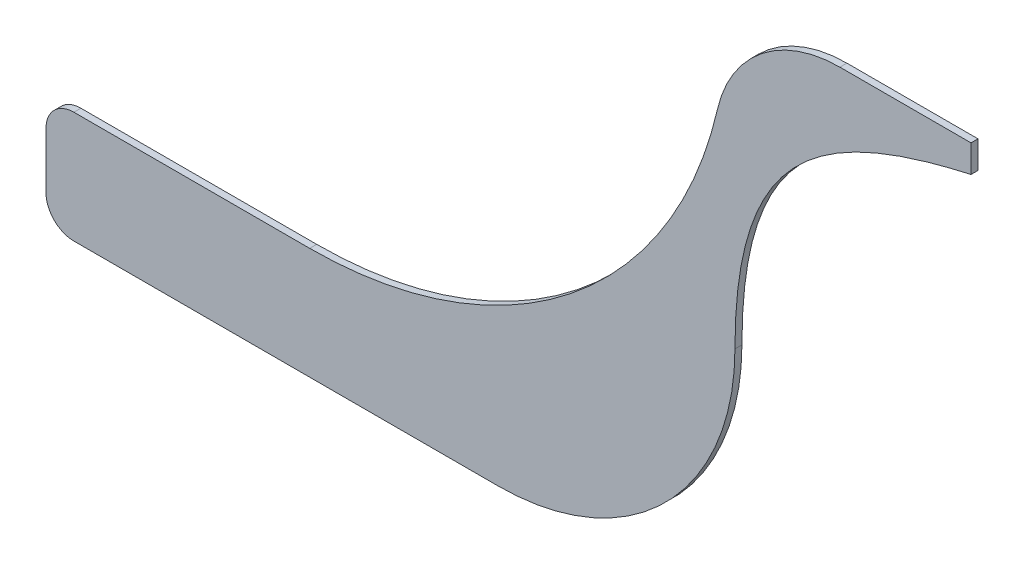
ISO-10303-21;
HEADER;
FILE_DESCRIPTION(('STEP AP214'),'2;1');
FILE_NAME('part.step','',(''),(''),'','','');
FILE_SCHEMA(('AUTOMOTIVE_DESIGN { 1 0 10303 214 1 1 1 1 }'));
ENDSEC;
DATA;
#1=APPLICATION_CONTEXT('core data for automotive mechanical design processes');
#2=APPLICATION_PROTOCOL_DEFINITION('international standard','automotive_design',2000,#1);
#3=PRODUCT_CONTEXT('',#1,'mechanical');
#4=PRODUCT('Part','Part','',(#3));
#5=PRODUCT_RELATED_PRODUCT_CATEGORY('part','',(#4));
#6=PRODUCT_DEFINITION_FORMATION('','',#4);
#7=PRODUCT_DEFINITION_CONTEXT('part definition',#1,'design');
#8=PRODUCT_DEFINITION('design','',#6,#7);
#9=PRODUCT_DEFINITION_SHAPE('','',#8);
#10=(LENGTH_UNIT() NAMED_UNIT(*) SI_UNIT(.MILLI.,.METRE.));
#11=(NAMED_UNIT(*) PLANE_ANGLE_UNIT() SI_UNIT($,.RADIAN.));
#12=(NAMED_UNIT(*) SI_UNIT($,.STERADIAN.) SOLID_ANGLE_UNIT());
#13=UNCERTAINTY_MEASURE_WITH_UNIT(LENGTH_MEASURE(1.E-05),#10,'distance_accuracy_value','');
#14=(GEOMETRIC_REPRESENTATION_CONTEXT(3) GLOBAL_UNCERTAINTY_ASSIGNED_CONTEXT((#13)) GLOBAL_UNIT_ASSIGNED_CONTEXT((#10,
#11,#12)) REPRESENTATION_CONTEXT('',''));
#15=CARTESIAN_POINT('',(0.,0.,0.));
#16=DIRECTION('',(0.,0.,1.));
#17=DIRECTION('',(1.,0.,0.));
#18=AXIS2_PLACEMENT_3D('',#15,#16,#17);
#19=CARTESIAN_POINT('',(390.725573839181,154.94,6.35));
#20=DIRECTION('',(0.,0.,-1.));
#21=DIRECTION('',(-1.,0.,0.));
#22=AXIS2_PLACEMENT_3D('',#19,#20,#21);
#23=CYLINDRICAL_SURFACE('',#22,215.9);
#24=CARTESIAN_POINT('',(390.725573839181,154.94,0.));
#25=DIRECTION('',(0.,0.,1.));
#26=DIRECTION('',(1.,0.,0.));
#27=AXIS2_PLACEMENT_3D('',#24,#25,#26);
#28=CIRCLE('',#27,215.9);
#29=CARTESIAN_POINT('',(390.725573839181,-60.96,0.));
#30=VERTEX_POINT('',#29);
#31=CARTESIAN_POINT('',(606.625573839181,154.94,0.));
#32=VERTEX_POINT('',#31);
#33=EDGE_CURVE('E147',#30,#32,#28,.T.);
#34=ORIENTED_EDGE('',*,*,#33,.T.);
#35=DIRECTION('',(0.,0.,-1.));
#36=VECTOR('',#35,1.);
#37=CARTESIAN_POINT('',(606.625573839181,154.94,6.35));
#38=LINE('',#37,#36);
#39=CARTESIAN_POINT('',(606.625573839181,154.94,6.35));
#40=VERTEX_POINT('',#39);
#41=EDGE_CURVE('E11',#40,#32,#38,.T.);
#42=ORIENTED_EDGE('',*,*,#41,.F.);
#43=CARTESIAN_POINT('',(390.725573839181,154.94,6.35));
#44=DIRECTION('',(0.,0.,1.));
#45=DIRECTION('',(1.,0.,0.));
#46=AXIS2_PLACEMENT_3D('',#43,#44,#45);
#47=CIRCLE('',#46,215.9);
#48=CARTESIAN_POINT('',(390.725573839181,-60.96,6.35));
#49=VERTEX_POINT('',#48);
#50=EDGE_CURVE('E176',#49,#40,#47,.T.);
#51=ORIENTED_EDGE('',*,*,#50,.F.);
#52=DIRECTION('',(0.,0.,-1.));
#53=VECTOR('',#52,1.);
#54=CARTESIAN_POINT('',(390.725573839181,-60.96,6.35));
#55=LINE('',#54,#53);
#56=EDGE_CURVE('E143',#49,#30,#55,.T.);
#57=ORIENTED_EDGE('',*,*,#56,.T.);
#58=EDGE_LOOP('',(#34,#42,#51,#57));
#59=FACE_BOUND('',#58,.T.);
#60=ADVANCED_FACE('F34',(#59),#23,.T.);
#61=CARTESIAN_POINT('',(606.625573839181,154.94,6.35));
#62=CARTESIAN_POINT('',(606.625573839181,316.010014209562,6.35));
#63=CARTESIAN_POINT('',(681.985382086751,368.523685091202,6.35));
#64=CARTESIAN_POINT('',(821.560436262669,399.924928327154,6.35));
#65=B_SPLINE_CURVE_WITH_KNOTS('',3,(#61,#62,#63,#64),.UNSPECIFIED.,.F.,.F.,(4,4),(0.,1.),.UNSPECIFIED.);
#66=DIRECTION('',(0.,0.,-1.));
#67=VECTOR('',#66,1.);
#68=SURFACE_OF_LINEAR_EXTRUSION('',#65,#67);
#69=CARTESIAN_POINT('',(606.625573839181,154.94,0.));
#70=CARTESIAN_POINT('',(606.625573839181,316.010014209562,0.));
#71=CARTESIAN_POINT('',(681.985382086751,368.523685091202,0.));
#72=CARTESIAN_POINT('',(821.560436262669,399.924928327154,0.));
#73=B_SPLINE_CURVE_WITH_KNOTS('',3,(#69,#70,#71,#72),.UNSPECIFIED.,.F.,.F.,(4,4),(0.,1.),.UNSPECIFIED.);
#74=CARTESIAN_POINT('',(821.560436262669,399.924928327154,0.));
#75=VERTEX_POINT('',#74);
#76=EDGE_CURVE('E150',#32,#75,#73,.T.);
#77=ORIENTED_EDGE('',*,*,#76,.T.);
#78=DIRECTION('',(0.,0.,-1.));
#79=VECTOR('',#78,1.);
#80=CARTESIAN_POINT('',(821.560436262669,399.924928327154,6.35));
#81=LINE('',#80,#79);
#82=CARTESIAN_POINT('',(821.560436262669,399.924928327154,6.35));
#83=VERTEX_POINT('',#82);
#84=EDGE_CURVE('E42',#83,#75,#81,.T.);
#85=ORIENTED_EDGE('',*,*,#84,.F.);
#86=EDGE_CURVE('E102',#40,#83,#65,.T.);
#87=ORIENTED_EDGE('',*,*,#86,.F.);
#88=ORIENTED_EDGE('',*,*,#41,.T.);
#89=EDGE_LOOP('',(#77,#85,#87,#88));
#90=FACE_BOUND('',#89,.T.);
#91=ADVANCED_FACE('F241',(#90),#68,.F.);
#92=CARTESIAN_POINT('',(821.560436262665,-7.31496953278176E-12,6.35));
#93=DIRECTION('',(-1.,0.,0.));
#94=DIRECTION('',(0.,-1.,0.));
#95=AXIS2_PLACEMENT_3D('',#92,#93,#94);
#96=PLANE('',#95);
#97=DIRECTION('',(0.,1.,0.));
#98=VECTOR('',#97,1.);
#99=CARTESIAN_POINT('',(821.560436262665,-7.31496953278176E-12,0.));
#100=LINE('',#99,#98);
#101=CARTESIAN_POINT('',(821.560436262669,424.863249898346,0.));
#102=VERTEX_POINT('',#101);
#103=EDGE_CURVE('E154',#75,#102,#100,.T.);
#104=ORIENTED_EDGE('',*,*,#103,.T.);
#105=DIRECTION('',(0.,0.,-1.));
#106=VECTOR('',#105,1.);
#107=CARTESIAN_POINT('',(821.560436262669,424.863249898346,6.35));
#108=LINE('',#107,#106);
#109=CARTESIAN_POINT('',(821.560436262669,424.863249898346,6.35));
#110=VERTEX_POINT('',#109);
#111=EDGE_CURVE('E189',#110,#102,#108,.T.);
#112=ORIENTED_EDGE('',*,*,#111,.F.);
#113=DIRECTION('',(0.,1.,0.));
#114=VECTOR('',#113,1.);
#115=CARTESIAN_POINT('',(821.560436262665,-7.31496953278176E-12,6.35));
#116=LINE('',#115,#114);
#117=EDGE_CURVE('E197',#83,#110,#116,.T.);
#118=ORIENTED_EDGE('',*,*,#117,.F.);
#119=ORIENTED_EDGE('',*,*,#84,.T.);
#120=EDGE_LOOP('',(#104,#112,#118,#119));
#121=FACE_BOUND('',#120,.T.);
#122=ADVANCED_FACE('F195',(#121),#96,.F.);
#123=CARTESIAN_POINT('',(0.,424.863249898346,6.35));
#124=DIRECTION('',(0.,-1.,0.));
#125=DIRECTION('',(0.,0.,-1.));
#126=AXIS2_PLACEMENT_3D('',#123,#124,#125);
#127=PLANE('',#126);
#128=DIRECTION('',(-1.,0.,0.));
#129=VECTOR('',#128,1.);
#130=CARTESIAN_POINT('',(0.,424.863249898346,0.));
#131=LINE('',#130,#129);
#132=CARTESIAN_POINT('',(702.170074113282,424.863249898346,0.));
#133=VERTEX_POINT('',#132);
#134=EDGE_CURVE('E159',#102,#133,#131,.T.);
#135=ORIENTED_EDGE('',*,*,#134,.T.);
#136=DIRECTION('',(0.,0.,-1.));
#137=VECTOR('',#136,1.);
#138=CARTESIAN_POINT('',(702.170074113282,424.863249898346,6.35));
#139=LINE('',#138,#137);
#140=CARTESIAN_POINT('',(702.170074113282,424.863249898346,6.35));
#141=VERTEX_POINT('',#140);
#142=EDGE_CURVE('E186',#141,#133,#139,.T.);
#143=ORIENTED_EDGE('',*,*,#142,.F.);
#144=DIRECTION('',(-1.,0.,0.));
#145=VECTOR('',#144,1.);
#146=CARTESIAN_POINT('',(0.,424.863249898346,6.35));
#147=LINE('',#146,#145);
#148=EDGE_CURVE('E215',#110,#141,#147,.T.);
#149=ORIENTED_EDGE('',*,*,#148,.F.);
#150=ORIENTED_EDGE('',*,*,#111,.T.);
#151=EDGE_LOOP('',(#135,#143,#149,#150));
#152=FACE_BOUND('',#151,.T.);
#153=ADVANCED_FACE('F205',(#152),#127,.F.);
#154=CARTESIAN_POINT('',(702.170074113282,310.563249898346,6.35));
#155=DIRECTION('',(0.,0.,-1.));
#156=DIRECTION('',(-1.,0.,0.));
#157=AXIS2_PLACEMENT_3D('',#154,#155,#156);
#158=CYLINDRICAL_SURFACE('',#157,114.3);
#159=CARTESIAN_POINT('',(702.170074113282,310.563249898346,0.));
#160=DIRECTION('',(0.,0.,1.));
#161=DIRECTION('',(1.,0.,0.));
#162=AXIS2_PLACEMENT_3D('',#159,#160,#161);
#163=CIRCLE('',#162,114.3);
#164=CARTESIAN_POINT('',(590.781410505333,336.196346075651,0.));
#165=VERTEX_POINT('',#164);
#166=EDGE_CURVE('E161',#133,#165,#163,.T.);
#167=ORIENTED_EDGE('',*,*,#166,.T.);
#168=DIRECTION('',(0.,0.,-1.));
#169=VECTOR('',#168,1.);
#170=CARTESIAN_POINT('',(590.781410505333,336.196346075651,6.35));
#171=LINE('',#170,#169);
#172=CARTESIAN_POINT('',(590.781410505333,336.196346075651,6.35));
#173=VERTEX_POINT('',#172);
#174=EDGE_CURVE('E184',#173,#165,#171,.T.);
#175=ORIENTED_EDGE('',*,*,#174,.F.);
#176=CARTESIAN_POINT('',(702.170074113282,310.563249898346,6.35));
#177=DIRECTION('',(0.,0.,1.));
#178=DIRECTION('',(1.,0.,0.));
#179=AXIS2_PLACEMENT_3D('',#176,#177,#178);
#180=CIRCLE('',#179,114.3);
#181=EDGE_CURVE('E211',#141,#173,#180,.T.);
#182=ORIENTED_EDGE('',*,*,#181,.F.);
#183=ORIENTED_EDGE('',*,*,#142,.T.);
#184=EDGE_LOOP('',(#167,#175,#182,#183));
#185=FACE_BOUND('',#184,.T.);
#186=ADVANCED_FACE('F209',(#185),#158,.T.);
#187=CARTESIAN_POINT('',(219.485865145499,421.64,6.35));
#188=DIRECTION('',(0.,0.,-1.));
#189=DIRECTION('',(-1.,0.,0.));
#190=AXIS2_PLACEMENT_3D('',#187,#188,#189);
#191=CYLINDRICAL_SURFACE('',#190,381.);
#192=CARTESIAN_POINT('',(219.485865145499,421.64,0.));
#193=DIRECTION('',(0.,0.,1.));
#194=DIRECTION('',(1.,0.,0.));
#195=AXIS2_PLACEMENT_3D('',#192,#193,#194);
#196=CIRCLE('',#195,381.);
#197=CARTESIAN_POINT('',(219.485865145499,40.64,0.));
#198=VERTEX_POINT('',#197);
#199=EDGE_CURVE('E164',#198,#165,#196,.T.);
#200=ORIENTED_EDGE('',*,*,#199,.F.);
#201=DIRECTION('',(0.,0.,-1.));
#202=VECTOR('',#201,1.);
#203=CARTESIAN_POINT('',(219.485865145499,40.64,6.35));
#204=LINE('',#203,#202);
#205=CARTESIAN_POINT('',(219.485865145499,40.64,6.35));
#206=VERTEX_POINT('',#205);
#207=EDGE_CURVE('E182',#206,#198,#204,.T.);
#208=ORIENTED_EDGE('',*,*,#207,.F.);
#209=CARTESIAN_POINT('',(219.485865145499,421.64,6.35));
#210=DIRECTION('',(0.,0.,1.));
#211=DIRECTION('',(1.,0.,0.));
#212=AXIS2_PLACEMENT_3D('',#209,#210,#211);
#213=CIRCLE('',#212,381.);
#214=EDGE_CURVE('E214',#206,#173,#213,.T.);
#215=ORIENTED_EDGE('',*,*,#214,.T.);
#216=ORIENTED_EDGE('',*,*,#174,.T.);
#217=EDGE_LOOP('',(#200,#208,#215,#216));
#218=FACE_BOUND('',#217,.T.);
#219=ADVANCED_FACE('F262',(#218),#191,.F.);
#220=CARTESIAN_POINT('',(0.,40.6399999999998,6.35));
#221=DIRECTION('',(0.,-1.,0.));
#222=DIRECTION('',(1.,0.,0.));
#223=AXIS2_PLACEMENT_3D('',#220,#221,#222);
#224=PLANE('',#223);
#225=DIRECTION('',(-1.,0.,0.));
#226=VECTOR('',#225,1.);
#227=CARTESIAN_POINT('',(0.,40.6399999999998,0.));
#228=LINE('',#227,#226);
#229=CARTESIAN_POINT('',(4.79079832994764,40.6399999999998,0.));
#230=VERTEX_POINT('',#229);
#231=EDGE_CURVE('E167',#198,#230,#228,.T.);
#232=ORIENTED_EDGE('',*,*,#231,.T.);
#233=DIRECTION('',(0.,0.,-1.));
#234=VECTOR('',#233,1.);
#235=CARTESIAN_POINT('',(4.79079832994764,40.6399999999998,6.35));
#236=LINE('',#235,#234);
#237=CARTESIAN_POINT('',(4.79079832994764,40.6399999999998,6.35));
#238=VERTEX_POINT('',#237);
#239=EDGE_CURVE('E180',#238,#230,#236,.T.);
#240=ORIENTED_EDGE('',*,*,#239,.F.);
#241=DIRECTION('',(-1.,0.,0.));
#242=VECTOR('',#241,1.);
#243=CARTESIAN_POINT('',(0.,40.6399999999998,6.35));
#244=LINE('',#243,#242);
#245=EDGE_CURVE('E217',#206,#238,#244,.T.);
#246=ORIENTED_EDGE('',*,*,#245,.F.);
#247=ORIENTED_EDGE('',*,*,#207,.T.);
#248=EDGE_LOOP('',(#232,#240,#246,#247));
#249=FACE_BOUND('',#248,.T.);
#250=ADVANCED_FACE('F265',(#249),#224,.F.);
#251=CARTESIAN_POINT('',(4.79079832994763,15.2399999999998,6.35));
#252=DIRECTION('',(0.,0.,-1.));
#253=DIRECTION('',(-1.,0.,0.));
#254=AXIS2_PLACEMENT_3D('',#251,#252,#253);
#255=CYLINDRICAL_SURFACE('',#254,25.4);
#256=CARTESIAN_POINT('',(4.79079832994763,15.2399999999998,0.));
#257=DIRECTION('',(0.,0.,1.));
#258=DIRECTION('',(1.,0.,0.));
#259=AXIS2_PLACEMENT_3D('',#256,#257,#258);
#260=CIRCLE('',#259,25.4);
#261=CARTESIAN_POINT('',(-20.6092016700524,15.2399999999998,0.));
#262=VERTEX_POINT('',#261);
#263=EDGE_CURVE('E170',#262,#230,#260,.F.);
#264=ORIENTED_EDGE('',*,*,#263,.F.);
#265=DIRECTION('',(0.,0.,-1.));
#266=VECTOR('',#265,1.);
#267=CARTESIAN_POINT('',(-20.6092016700524,15.2399999999998,6.35));
#268=LINE('',#267,#266);
#269=CARTESIAN_POINT('',(-20.6092016700524,15.2399999999998,6.35));
#270=VERTEX_POINT('',#269);
#271=EDGE_CURVE('E138',#270,#262,#268,.T.);
#272=ORIENTED_EDGE('',*,*,#271,.F.);
#273=CARTESIAN_POINT('',(4.79079832994763,15.2399999999998,6.35));
#274=DIRECTION('',(0.,0.,1.));
#275=DIRECTION('',(1.,0.,0.));
#276=AXIS2_PLACEMENT_3D('',#273,#274,#275);
#277=CIRCLE('',#276,25.4);
#278=EDGE_CURVE('E131',#270,#238,#277,.F.);
#279=ORIENTED_EDGE('',*,*,#278,.T.);
#280=ORIENTED_EDGE('',*,*,#239,.T.);
#281=EDGE_LOOP('',(#264,#272,#279,#280));
#282=FACE_BOUND('',#281,.T.);
#283=ADVANCED_FACE('F224',(#282),#255,.T.);
#284=CARTESIAN_POINT('',(-20.6092016700524,0.,6.35));
#285=DIRECTION('',(1.,0.,0.));
#286=DIRECTION('',(0.,0.,-1.));
#287=AXIS2_PLACEMENT_3D('',#284,#285,#286);
#288=PLANE('',#287);
#289=DIRECTION('',(0.,-1.,0.));
#290=VECTOR('',#289,1.);
#291=CARTESIAN_POINT('',(-20.6092016700524,0.,0.));
#292=LINE('',#291,#290);
#293=CARTESIAN_POINT('',(-20.6092016700524,-35.56,0.));
#294=VERTEX_POINT('',#293);
#295=EDGE_CURVE('E137',#262,#294,#292,.T.);
#296=ORIENTED_EDGE('',*,*,#295,.T.);
#297=DIRECTION('',(0.,0.,-1.));
#298=VECTOR('',#297,1.);
#299=CARTESIAN_POINT('',(-20.6092016700524,-35.56,6.35));
#300=LINE('',#299,#298);
#301=CARTESIAN_POINT('',(-20.6092016700524,-35.56,6.35));
#302=VERTEX_POINT('',#301);
#303=EDGE_CURVE('E134',#302,#294,#300,.T.);
#304=ORIENTED_EDGE('',*,*,#303,.F.);
#305=DIRECTION('',(0.,-1.,0.));
#306=VECTOR('',#305,1.);
#307=CARTESIAN_POINT('',(-20.6092016700524,0.,6.35));
#308=LINE('',#307,#306);
#309=EDGE_CURVE('E125',#270,#302,#308,.T.);
#310=ORIENTED_EDGE('',*,*,#309,.F.);
#311=ORIENTED_EDGE('',*,*,#271,.T.);
#312=EDGE_LOOP('',(#296,#304,#310,#311));
#313=FACE_BOUND('',#312,.T.);
#314=ADVANCED_FACE('F135',(#313),#288,.F.);
#315=CARTESIAN_POINT('',(4.79079832994762,-35.56,6.35));
#316=DIRECTION('',(0.,0.,-1.));
#317=DIRECTION('',(-1.,0.,0.));
#318=AXIS2_PLACEMENT_3D('',#315,#316,#317);
#319=CYLINDRICAL_SURFACE('',#318,25.4);
#320=CARTESIAN_POINT('',(4.79079832994762,-35.56,0.));
#321=DIRECTION('',(0.,0.,1.));
#322=DIRECTION('',(1.,0.,0.));
#323=AXIS2_PLACEMENT_3D('',#320,#321,#322);
#324=CIRCLE('',#323,25.4);
#325=CARTESIAN_POINT('',(4.79079832994763,-60.96,0.));
#326=VERTEX_POINT('',#325);
#327=EDGE_CURVE('E88',#294,#326,#324,.T.);
#328=ORIENTED_EDGE('',*,*,#327,.T.);
#329=DIRECTION('',(0.,0.,-1.));
#330=VECTOR('',#329,1.);
#331=CARTESIAN_POINT('',(4.79079832994763,-60.96,6.35));
#332=LINE('',#331,#330);
#333=CARTESIAN_POINT('',(4.79079832994763,-60.96,6.35));
#334=VERTEX_POINT('',#333);
#335=EDGE_CURVE('E139',#334,#326,#332,.T.);
#336=ORIENTED_EDGE('',*,*,#335,.F.);
#337=CARTESIAN_POINT('',(4.79079832994762,-35.56,6.35));
#338=DIRECTION('',(0.,0.,1.));
#339=DIRECTION('',(1.,0.,0.));
#340=AXIS2_PLACEMENT_3D('',#337,#338,#339);
#341=CIRCLE('',#340,25.4);
#342=EDGE_CURVE('E129',#302,#334,#341,.T.);
#343=ORIENTED_EDGE('',*,*,#342,.F.);
#344=ORIENTED_EDGE('',*,*,#303,.T.);
#345=EDGE_LOOP('',(#328,#336,#343,#344));
#346=FACE_BOUND('',#345,.T.);
#347=ADVANCED_FACE('F141',(#346),#319,.T.);
#348=CARTESIAN_POINT('',(0.,-60.96,6.35));
#349=DIRECTION('',(0.,1.,0.));
#350=DIRECTION('',(-1.,0.,0.));
#351=AXIS2_PLACEMENT_3D('',#348,#349,#350);
#352=PLANE('',#351);
#353=DIRECTION('',(1.,0.,0.));
#354=VECTOR('',#353,1.);
#355=CARTESIAN_POINT('',(0.,-60.96,0.));
#356=LINE('',#355,#354);
#357=EDGE_CURVE('E94',#326,#30,#356,.T.);
#358=ORIENTED_EDGE('',*,*,#357,.T.);
#359=ORIENTED_EDGE('',*,*,#56,.F.);
#360=DIRECTION('',(1.,0.,0.));
#361=VECTOR('',#360,1.);
#362=CARTESIAN_POINT('',(0.,-60.96,6.35));
#363=LINE('',#362,#361);
#364=EDGE_CURVE('E50',#334,#49,#363,.T.);
#365=ORIENTED_EDGE('',*,*,#364,.F.);
#366=ORIENTED_EDGE('',*,*,#335,.T.);
#367=EDGE_LOOP('',(#358,#359,#365,#366));
#368=FACE_BOUND('',#367,.T.);
#369=ADVANCED_FACE('F230',(#368),#352,.F.);
#370=CARTESIAN_POINT('',(0.,0.,6.35));
#371=DIRECTION('',(0.,0.,1.));
#372=DIRECTION('',(1.,0.,0.));
#373=AXIS2_PLACEMENT_3D('',#370,#371,#372);
#374=PLANE('',#373);
#375=ORIENTED_EDGE('',*,*,#50,.T.);
#376=ORIENTED_EDGE('',*,*,#86,.T.);
#377=ORIENTED_EDGE('',*,*,#117,.T.);
#378=ORIENTED_EDGE('',*,*,#148,.T.);
#379=ORIENTED_EDGE('',*,*,#181,.T.);
#380=ORIENTED_EDGE('',*,*,#214,.F.);
#381=ORIENTED_EDGE('',*,*,#245,.T.);
#382=ORIENTED_EDGE('',*,*,#278,.F.);
#383=ORIENTED_EDGE('',*,*,#309,.T.);
#384=ORIENTED_EDGE('',*,*,#342,.T.);
#385=ORIENTED_EDGE('',*,*,#364,.T.);
#386=EDGE_LOOP('',(#375,#376,#377,#378,#379,#380,#381,#382,#383,#384,#385));
#387=FACE_BOUND('',#386,.T.);
#388=ADVANCED_FACE('F127',(#387),#374,.T.);
#389=CARTESIAN_POINT('',(0.,0.,0.));
#390=DIRECTION('',(0.,0.,1.));
#391=DIRECTION('',(1.,0.,0.));
#392=AXIS2_PLACEMENT_3D('',#389,#390,#391);
#393=PLANE('',#392);
#394=ORIENTED_EDGE('',*,*,#33,.F.);
#395=ORIENTED_EDGE('',*,*,#357,.F.);
#396=ORIENTED_EDGE('',*,*,#327,.F.);
#397=ORIENTED_EDGE('',*,*,#295,.F.);
#398=ORIENTED_EDGE('',*,*,#263,.T.);
#399=ORIENTED_EDGE('',*,*,#231,.F.);
#400=ORIENTED_EDGE('',*,*,#199,.T.);
#401=ORIENTED_EDGE('',*,*,#166,.F.);
#402=ORIENTED_EDGE('',*,*,#134,.F.);
#403=ORIENTED_EDGE('',*,*,#103,.F.);
#404=ORIENTED_EDGE('',*,*,#76,.F.);
#405=EDGE_LOOP('',(#394,#395,#396,#397,#398,#399,#400,#401,#402,#403,#404));
#406=FACE_BOUND('',#405,.T.);
#407=ADVANCED_FACE('F201',(#406),#393,.F.);
#408=CLOSED_SHELL('',(#60,#91,#122,#153,#186,#219,#250,#283,#314,#347,#369,#388,#407));
#409=MANIFOLD_SOLID_BREP('B2',#408);
#410=ADVANCED_BREP_SHAPE_REPRESENTATION('',(#18,#409),#14);
#411=SHAPE_DEFINITION_REPRESENTATION(#9,#410);
ENDSEC;
END-ISO-10303-21;
